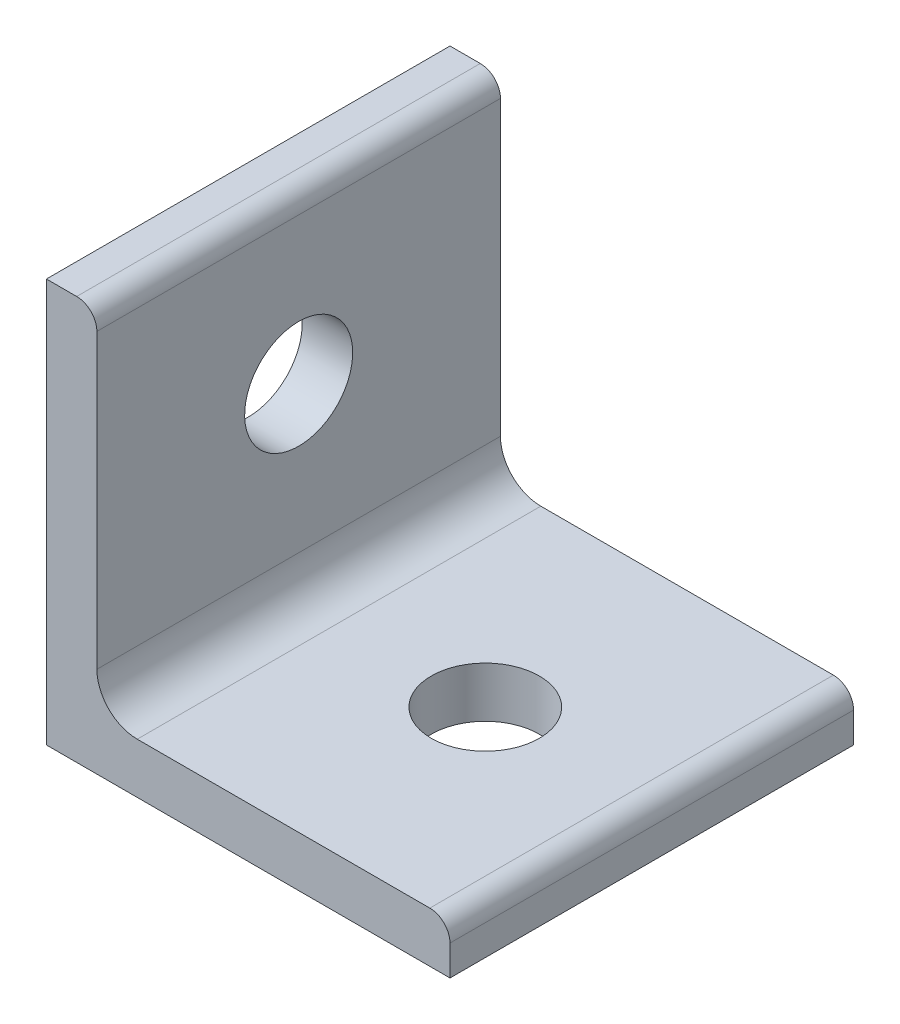
ISO-10303-21;
HEADER;
FILE_DESCRIPTION(('STEP AP214'),'2;1');
FILE_NAME('part.step','',(''),(''),'','','');
FILE_SCHEMA(('AUTOMOTIVE_DESIGN { 1 0 10303 214 1 1 1 1 }'));
ENDSEC;
DATA;
#1=APPLICATION_CONTEXT('core data for automotive mechanical design processes');
#2=APPLICATION_PROTOCOL_DEFINITION('international standard','automotive_design',2000,#1);
#3=PRODUCT_CONTEXT('',#1,'mechanical');
#4=PRODUCT('Part','Part','',(#3));
#5=PRODUCT_RELATED_PRODUCT_CATEGORY('part','',(#4));
#6=PRODUCT_DEFINITION_FORMATION('','',#4);
#7=PRODUCT_DEFINITION_CONTEXT('part definition',#1,'design');
#8=PRODUCT_DEFINITION('design','',#6,#7);
#9=PRODUCT_DEFINITION_SHAPE('','',#8);
#10=(LENGTH_UNIT() NAMED_UNIT(*) SI_UNIT(.MILLI.,.METRE.));
#11=(NAMED_UNIT(*) PLANE_ANGLE_UNIT() SI_UNIT($,.RADIAN.));
#12=(NAMED_UNIT(*) SI_UNIT($,.STERADIAN.) SOLID_ANGLE_UNIT());
#13=UNCERTAINTY_MEASURE_WITH_UNIT(LENGTH_MEASURE(1.E-05),#10,'distance_accuracy_value','');
#14=(GEOMETRIC_REPRESENTATION_CONTEXT(3) GLOBAL_UNCERTAINTY_ASSIGNED_CONTEXT((#13)) GLOBAL_UNIT_ASSIGNED_CONTEXT((#10,
#11,#12)) REPRESENTATION_CONTEXT('',''));
#15=CARTESIAN_POINT('',(0.,0.,0.));
#16=DIRECTION('',(0.,0.,1.));
#17=DIRECTION('',(1.,0.,0.));
#18=AXIS2_PLACEMENT_3D('',#15,#16,#17);
#19=CARTESIAN_POINT('',(12.7,0.,12.7));
#20=DIRECTION('',(0.,1.,0.));
#21=DIRECTION('',(-1.,0.,0.));
#22=AXIS2_PLACEMENT_3D('',#19,#20,#21);
#23=PLANE('',#22);
#24=CARTESIAN_POINT('',(7.46125,0.,6.35));
#25=DIRECTION('',(0.,1.,0.));
#26=DIRECTION('',(0.,0.,1.));
#27=AXIS2_PLACEMENT_3D('',#24,#25,#26);
#28=CIRCLE('',#27,1.7);
#29=CARTESIAN_POINT('',(7.46125,0.,8.05));
#30=VERTEX_POINT('',#29);
#31=EDGE_CURVE('E199',#30,#30,#28,.T.);
#32=ORIENTED_EDGE('',*,*,#31,.T.);
#33=EDGE_LOOP('',(#32));
#34=FACE_BOUND('',#33,.T.);
#35=DIRECTION('',(1.,0.,0.));
#36=VECTOR('',#35,1.);
#37=CARTESIAN_POINT('',(12.7,0.,0.));
#38=LINE('',#37,#36);
#39=CARTESIAN_POINT('',(0.,0.,0.));
#40=VERTEX_POINT('',#39);
#41=CARTESIAN_POINT('',(12.7,0.,0.));
#42=VERTEX_POINT('',#41);
#43=EDGE_CURVE('E127',#40,#42,#38,.T.);
#44=ORIENTED_EDGE('',*,*,#43,.T.);
#45=DIRECTION('',(0.,0.,-1.));
#46=VECTOR('',#45,1.);
#47=CARTESIAN_POINT('',(12.7,0.,12.7));
#48=LINE('',#47,#46);
#49=CARTESIAN_POINT('',(12.7,0.,12.7));
#50=VERTEX_POINT('',#49);
#51=EDGE_CURVE('E109',#50,#42,#48,.T.);
#52=ORIENTED_EDGE('',*,*,#51,.F.);
#53=DIRECTION('',(1.,0.,0.));
#54=VECTOR('',#53,1.);
#55=CARTESIAN_POINT('',(12.7,0.,12.7));
#56=LINE('',#55,#54);
#57=CARTESIAN_POINT('',(0.,0.,12.7));
#58=VERTEX_POINT('',#57);
#59=EDGE_CURVE('E115',#58,#50,#56,.T.);
#60=ORIENTED_EDGE('',*,*,#59,.F.);
#61=DIRECTION('',(0.,0.,-1.));
#62=VECTOR('',#61,1.);
#63=CARTESIAN_POINT('',(0.,0.,12.7));
#64=LINE('',#63,#62);
#65=EDGE_CURVE('E135',#58,#40,#64,.T.);
#66=ORIENTED_EDGE('',*,*,#65,.T.);
#67=EDGE_LOOP('',(#44,#52,#60,#66));
#68=FACE_BOUND('',#67,.T.);
#69=ADVANCED_FACE('F33',(#34,#68),#23,.F.);
#70=CARTESIAN_POINT('',(12.7,1.5875,12.7));
#71=DIRECTION('',(-1.,0.,0.));
#72=DIRECTION('',(0.,0.,1.));
#73=AXIS2_PLACEMENT_3D('',#70,#71,#72);
#74=PLANE('',#73);
#75=DIRECTION('',(0.,1.,0.));
#76=VECTOR('',#75,1.);
#77=CARTESIAN_POINT('',(12.7,1.5875,0.));
#78=LINE('',#77,#76);
#79=CARTESIAN_POINT('',(12.7,0.9525,0.));
#80=VERTEX_POINT('',#79);
#81=EDGE_CURVE('E182',#42,#80,#78,.T.);
#82=ORIENTED_EDGE('',*,*,#81,.T.);
#83=DIRECTION('',(0.,0.,-1.));
#84=VECTOR('',#83,1.);
#85=CARTESIAN_POINT('',(12.7,0.9525,12.7));
#86=LINE('',#85,#84);
#87=CARTESIAN_POINT('',(12.7,0.9525,12.7));
#88=VERTEX_POINT('',#87);
#89=EDGE_CURVE('E112',#80,#88,#86,.F.);
#90=ORIENTED_EDGE('',*,*,#89,.T.);
#91=DIRECTION('',(0.,1.,0.));
#92=VECTOR('',#91,1.);
#93=CARTESIAN_POINT('',(12.7,1.5875,12.7));
#94=LINE('',#93,#92);
#95=EDGE_CURVE('E104',#50,#88,#94,.T.);
#96=ORIENTED_EDGE('',*,*,#95,.F.);
#97=ORIENTED_EDGE('',*,*,#51,.T.);
#98=EDGE_LOOP('',(#82,#90,#96,#97));
#99=FACE_BOUND('',#98,.T.);
#100=ADVANCED_FACE('F107',(#99),#74,.F.);
#101=CARTESIAN_POINT('',(1.5875,1.5875,12.7));
#102=DIRECTION('',(0.,-1.,0.));
#103=DIRECTION('',(0.,0.,-1.));
#104=AXIS2_PLACEMENT_3D('',#101,#102,#103);
#105=PLANE('',#104);
#106=CARTESIAN_POINT('',(7.46125,1.5875,6.35));
#107=DIRECTION('',(0.,1.,0.));
#108=DIRECTION('',(0.,0.,1.));
#109=AXIS2_PLACEMENT_3D('',#106,#107,#108);
#110=CIRCLE('',#109,1.7);
#111=CARTESIAN_POINT('',(7.46125,1.5875,8.05));
#112=VERTEX_POINT('',#111);
#113=EDGE_CURVE('E202',#112,#112,#110,.T.);
#114=ORIENTED_EDGE('',*,*,#113,.F.);
#115=EDGE_LOOP('',(#114));
#116=FACE_BOUND('',#115,.T.);
#117=DIRECTION('',(-1.,0.,0.));
#118=VECTOR('',#117,1.);
#119=CARTESIAN_POINT('',(1.5875,1.5875,12.7));
#120=LINE('',#119,#118);
#121=CARTESIAN_POINT('',(12.065,1.5875,12.7));
#122=VERTEX_POINT('',#121);
#123=CARTESIAN_POINT('',(2.8575,1.5875,12.7));
#124=VERTEX_POINT('',#123);
#125=EDGE_CURVE('E114',#122,#124,#120,.T.);
#126=ORIENTED_EDGE('',*,*,#125,.F.);
#127=DIRECTION('',(0.,0.,-1.));
#128=VECTOR('',#127,1.);
#129=CARTESIAN_POINT('',(12.065,1.5875,12.7));
#130=LINE('',#129,#128);
#131=CARTESIAN_POINT('',(12.065,1.5875,0.));
#132=VERTEX_POINT('',#131);
#133=EDGE_CURVE('E146',#122,#132,#130,.T.);
#134=ORIENTED_EDGE('',*,*,#133,.T.);
#135=DIRECTION('',(-1.,0.,0.));
#136=VECTOR('',#135,1.);
#137=CARTESIAN_POINT('',(1.5875,1.5875,0.));
#138=LINE('',#137,#136);
#139=CARTESIAN_POINT('',(2.8575,1.5875,0.));
#140=VERTEX_POINT('',#139);
#141=EDGE_CURVE('E173',#132,#140,#138,.T.);
#142=ORIENTED_EDGE('',*,*,#141,.T.);
#143=DIRECTION('',(0.,0.,-1.));
#144=VECTOR('',#143,1.);
#145=CARTESIAN_POINT('',(2.8575,1.5875,12.7));
#146=LINE('',#145,#144);
#147=EDGE_CURVE('E132',#140,#124,#146,.F.);
#148=ORIENTED_EDGE('',*,*,#147,.T.);
#149=EDGE_LOOP('',(#126,#134,#142,#148));
#150=FACE_BOUND('',#149,.T.);
#151=ADVANCED_FACE('F186',(#116,#150),#105,.F.);
#152=CARTESIAN_POINT('',(1.5875,12.7,12.7));
#153=DIRECTION('',(-1.,0.,0.));
#154=DIRECTION('',(0.,-1.,0.));
#155=AXIS2_PLACEMENT_3D('',#152,#153,#154);
#156=PLANE('',#155);
#157=CARTESIAN_POINT('',(1.5875,7.46125,6.35));
#158=DIRECTION('',(1.,0.,0.));
#159=DIRECTION('',(0.,1.,0.));
#160=AXIS2_PLACEMENT_3D('',#157,#158,#159);
#161=CIRCLE('',#160,1.7);
#162=CARTESIAN_POINT('',(1.5875,9.16125,6.35));
#163=VERTEX_POINT('',#162);
#164=EDGE_CURVE('E196',#163,#163,#161,.T.);
#165=ORIENTED_EDGE('',*,*,#164,.F.);
#166=EDGE_LOOP('',(#165));
#167=FACE_BOUND('',#166,.T.);
#168=DIRECTION('',(0.,1.,0.));
#169=VECTOR('',#168,1.);
#170=CARTESIAN_POINT('',(1.5875,12.7,0.));
#171=LINE('',#170,#169);
#172=CARTESIAN_POINT('',(1.5875,2.8575,0.));
#173=VERTEX_POINT('',#172);
#174=CARTESIAN_POINT('',(1.5875,12.065,0.));
#175=VERTEX_POINT('',#174);
#176=EDGE_CURVE('E170',#173,#175,#171,.T.);
#177=ORIENTED_EDGE('',*,*,#176,.T.);
#178=DIRECTION('',(0.,0.,-1.));
#179=VECTOR('',#178,1.);
#180=CARTESIAN_POINT('',(1.5875,12.065,12.7));
#181=LINE('',#180,#179);
#182=CARTESIAN_POINT('',(1.5875,12.065,12.7));
#183=VERTEX_POINT('',#182);
#184=EDGE_CURVE('E11',#175,#183,#181,.F.);
#185=ORIENTED_EDGE('',*,*,#184,.T.);
#186=DIRECTION('',(0.,1.,0.));
#187=VECTOR('',#186,1.);
#188=CARTESIAN_POINT('',(1.5875,12.7,12.7));
#189=LINE('',#188,#187);
#190=CARTESIAN_POINT('',(1.5875,2.8575,12.7));
#191=VERTEX_POINT('',#190);
#192=EDGE_CURVE('E177',#191,#183,#189,.T.);
#193=ORIENTED_EDGE('',*,*,#192,.F.);
#194=DIRECTION('',(0.,0.,-1.));
#195=VECTOR('',#194,1.);
#196=CARTESIAN_POINT('',(1.5875,2.8575,0.));
#197=LINE('',#196,#195);
#198=EDGE_CURVE('E128',#191,#173,#197,.T.);
#199=ORIENTED_EDGE('',*,*,#198,.T.);
#200=EDGE_LOOP('',(#177,#185,#193,#199));
#201=FACE_BOUND('',#200,.T.);
#202=ADVANCED_FACE('F193',(#167,#201),#156,.F.);
#203=CARTESIAN_POINT('',(1.5875,12.7,12.7));
#204=DIRECTION('',(0.,-1.,0.));
#205=DIRECTION('',(0.,0.,-1.));
#206=AXIS2_PLACEMENT_3D('',#203,#204,#205);
#207=PLANE('',#206);
#208=DIRECTION('',(-1.,0.,0.));
#209=VECTOR('',#208,1.);
#210=CARTESIAN_POINT('',(1.5875,12.7,12.7));
#211=LINE('',#210,#209);
#212=CARTESIAN_POINT('',(0.9525,12.7,12.7));
#213=VERTEX_POINT('',#212);
#214=CARTESIAN_POINT('',(0.,12.7,12.7));
#215=VERTEX_POINT('',#214);
#216=EDGE_CURVE('E163',#213,#215,#211,.T.);
#217=ORIENTED_EDGE('',*,*,#216,.F.);
#218=DIRECTION('',(0.,0.,-1.));
#219=VECTOR('',#218,1.);
#220=CARTESIAN_POINT('',(0.9525,12.7,12.7));
#221=LINE('',#220,#219);
#222=CARTESIAN_POINT('',(0.9525,12.7,0.));
#223=VERTEX_POINT('',#222);
#224=EDGE_CURVE('E41',#213,#223,#221,.T.);
#225=ORIENTED_EDGE('',*,*,#224,.T.);
#226=DIRECTION('',(-1.,0.,0.));
#227=VECTOR('',#226,1.);
#228=CARTESIAN_POINT('',(1.5875,12.7,0.));
#229=LINE('',#228,#227);
#230=CARTESIAN_POINT('',(0.,12.7,0.));
#231=VERTEX_POINT('',#230);
#232=EDGE_CURVE('E162',#223,#231,#229,.T.);
#233=ORIENTED_EDGE('',*,*,#232,.T.);
#234=DIRECTION('',(0.,0.,-1.));
#235=VECTOR('',#234,1.);
#236=CARTESIAN_POINT('',(0.,12.7,12.7));
#237=LINE('',#236,#235);
#238=EDGE_CURVE('E129',#215,#231,#237,.T.);
#239=ORIENTED_EDGE('',*,*,#238,.F.);
#240=EDGE_LOOP('',(#217,#225,#233,#239));
#241=FACE_BOUND('',#240,.T.);
#242=ADVANCED_FACE('F160',(#241),#207,.F.);
#243=CARTESIAN_POINT('',(0.,0.,12.7));
#244=DIRECTION('',(1.,0.,0.));
#245=DIRECTION('',(0.,0.,-1.));
#246=AXIS2_PLACEMENT_3D('',#243,#244,#245);
#247=PLANE('',#246);
#248=CARTESIAN_POINT('',(0.,7.46125,6.35));
#249=DIRECTION('',(1.,0.,0.));
#250=DIRECTION('',(0.,1.,0.));
#251=AXIS2_PLACEMENT_3D('',#248,#249,#250);
#252=CIRCLE('',#251,1.7);
#253=CARTESIAN_POINT('',(0.,9.16125,6.35));
#254=VERTEX_POINT('',#253);
#255=EDGE_CURVE('E183',#254,#254,#252,.T.);
#256=ORIENTED_EDGE('',*,*,#255,.T.);
#257=EDGE_LOOP('',(#256));
#258=FACE_BOUND('',#257,.T.);
#259=DIRECTION('',(0.,-1.,0.));
#260=VECTOR('',#259,1.);
#261=CARTESIAN_POINT('',(0.,0.,0.));
#262=LINE('',#261,#260);
#263=EDGE_CURVE('E124',#231,#40,#262,.T.);
#264=ORIENTED_EDGE('',*,*,#263,.T.);
#265=ORIENTED_EDGE('',*,*,#65,.F.);
#266=DIRECTION('',(0.,-1.,0.));
#267=VECTOR('',#266,1.);
#268=CARTESIAN_POINT('',(0.,0.,12.7));
#269=LINE('',#268,#267);
#270=EDGE_CURVE('E120',#215,#58,#269,.T.);
#271=ORIENTED_EDGE('',*,*,#270,.F.);
#272=ORIENTED_EDGE('',*,*,#238,.T.);
#273=EDGE_LOOP('',(#264,#265,#271,#272));
#274=FACE_BOUND('',#273,.T.);
#275=ADVANCED_FACE('F249',(#258,#274),#247,.F.);
#276=CARTESIAN_POINT('',(0.,0.,12.7));
#277=DIRECTION('',(0.,0.,-1.));
#278=DIRECTION('',(-1.,0.,0.));
#279=AXIS2_PLACEMENT_3D('',#276,#277,#278);
#280=PLANE('',#279);
#281=ORIENTED_EDGE('',*,*,#95,.T.);
#282=CARTESIAN_POINT('',(12.065,0.9525,12.7));
#283=DIRECTION('',(0.,0.,-1.));
#284=DIRECTION('',(-1.,0.,0.));
#285=AXIS2_PLACEMENT_3D('',#282,#283,#284);
#286=CIRCLE('',#285,0.635);
#287=EDGE_CURVE('E155',#88,#122,#286,.F.);
#288=ORIENTED_EDGE('',*,*,#287,.T.);
#289=ORIENTED_EDGE('',*,*,#125,.T.);
#290=CARTESIAN_POINT('',(2.8575,2.8575,12.7));
#291=DIRECTION('',(0.,0.,-1.));
#292=DIRECTION('',(-1.,0.,0.));
#293=AXIS2_PLACEMENT_3D('',#290,#291,#292);
#294=CIRCLE('',#293,1.27);
#295=EDGE_CURVE('E144',#124,#191,#294,.T.);
#296=ORIENTED_EDGE('',*,*,#295,.T.);
#297=ORIENTED_EDGE('',*,*,#192,.T.);
#298=CARTESIAN_POINT('',(0.9525,12.065,12.7));
#299=DIRECTION('',(0.,0.,-1.));
#300=DIRECTION('',(-1.,0.,0.));
#301=AXIS2_PLACEMENT_3D('',#298,#299,#300);
#302=CIRCLE('',#301,0.635);
#303=EDGE_CURVE('E48',#183,#213,#302,.F.);
#304=ORIENTED_EDGE('',*,*,#303,.T.);
#305=ORIENTED_EDGE('',*,*,#216,.T.);
#306=ORIENTED_EDGE('',*,*,#270,.T.);
#307=ORIENTED_EDGE('',*,*,#59,.T.);
#308=EDGE_LOOP('',(#281,#288,#289,#296,#297,#304,#305,#306,#307));
#309=FACE_BOUND('',#308,.T.);
#310=ADVANCED_FACE('F118',(#309),#280,.F.);
#311=CARTESIAN_POINT('',(0.,0.,0.));
#312=DIRECTION('',(0.,0.,-1.));
#313=DIRECTION('',(-1.,0.,0.));
#314=AXIS2_PLACEMENT_3D('',#311,#312,#313);
#315=PLANE('',#314);
#316=ORIENTED_EDGE('',*,*,#141,.F.);
#317=CARTESIAN_POINT('',(12.065,0.9525,0.));
#318=DIRECTION('',(0.,0.,-1.));
#319=DIRECTION('',(-1.,0.,0.));
#320=AXIS2_PLACEMENT_3D('',#317,#318,#319);
#321=CIRCLE('',#320,0.635);
#322=EDGE_CURVE('E151',#132,#80,#321,.T.);
#323=ORIENTED_EDGE('',*,*,#322,.T.);
#324=ORIENTED_EDGE('',*,*,#81,.F.);
#325=ORIENTED_EDGE('',*,*,#43,.F.);
#326=ORIENTED_EDGE('',*,*,#263,.F.);
#327=ORIENTED_EDGE('',*,*,#232,.F.);
#328=CARTESIAN_POINT('',(0.9525,12.065,0.));
#329=DIRECTION('',(0.,0.,-1.));
#330=DIRECTION('',(-1.,0.,0.));
#331=AXIS2_PLACEMENT_3D('',#328,#329,#330);
#332=CIRCLE('',#331,0.635);
#333=EDGE_CURVE('E149',#223,#175,#332,.T.);
#334=ORIENTED_EDGE('',*,*,#333,.T.);
#335=ORIENTED_EDGE('',*,*,#176,.F.);
#336=CARTESIAN_POINT('',(2.8575,2.8575,0.));
#337=DIRECTION('',(0.,0.,-1.));
#338=DIRECTION('',(-1.,0.,0.));
#339=AXIS2_PLACEMENT_3D('',#336,#337,#338);
#340=CIRCLE('',#339,1.27);
#341=EDGE_CURVE('E141',#173,#140,#340,.F.);
#342=ORIENTED_EDGE('',*,*,#341,.T.);
#343=EDGE_LOOP('',(#316,#323,#324,#325,#326,#327,#334,#335,#342));
#344=FACE_BOUND('',#343,.T.);
#345=ADVANCED_FACE('F168',(#344),#315,.T.);
#346=CARTESIAN_POINT('',(2.8575,2.8575,12.7));
#347=DIRECTION('',(0.,0.,1.));
#348=DIRECTION('',(1.,0.,0.));
#349=AXIS2_PLACEMENT_3D('',#346,#347,#348);
#350=CYLINDRICAL_SURFACE('',#349,1.27);
#351=ORIENTED_EDGE('',*,*,#295,.F.);
#352=ORIENTED_EDGE('',*,*,#147,.F.);
#353=ORIENTED_EDGE('',*,*,#341,.F.);
#354=ORIENTED_EDGE('',*,*,#198,.F.);
#355=EDGE_LOOP('',(#351,#352,#353,#354));
#356=FACE_BOUND('',#355,.T.);
#357=ADVANCED_FACE('F192',(#356),#350,.F.);
#358=CARTESIAN_POINT('',(12.065,0.9525,12.7));
#359=DIRECTION('',(0.,0.,-1.));
#360=DIRECTION('',(-1.,0.,0.));
#361=AXIS2_PLACEMENT_3D('',#358,#359,#360);
#362=CYLINDRICAL_SURFACE('',#361,0.635);
#363=ORIENTED_EDGE('',*,*,#287,.F.);
#364=ORIENTED_EDGE('',*,*,#89,.F.);
#365=ORIENTED_EDGE('',*,*,#322,.F.);
#366=ORIENTED_EDGE('',*,*,#133,.F.);
#367=EDGE_LOOP('',(#363,#364,#365,#366));
#368=FACE_BOUND('',#367,.T.);
#369=ADVANCED_FACE('F231',(#368),#362,.T.);
#370=CARTESIAN_POINT('',(0.9525,12.065,12.7));
#371=DIRECTION('',(0.,0.,-1.));
#372=DIRECTION('',(-1.,0.,0.));
#373=AXIS2_PLACEMENT_3D('',#370,#371,#372);
#374=CYLINDRICAL_SURFACE('',#373,0.635);
#375=ORIENTED_EDGE('',*,*,#303,.F.);
#376=ORIENTED_EDGE('',*,*,#184,.F.);
#377=ORIENTED_EDGE('',*,*,#333,.F.);
#378=ORIENTED_EDGE('',*,*,#224,.F.);
#379=EDGE_LOOP('',(#375,#376,#377,#378));
#380=FACE_BOUND('',#379,.T.);
#381=ADVANCED_FACE('F35',(#380),#374,.T.);
#382=CARTESIAN_POINT('',(0.,7.46125,6.35));
#383=DIRECTION('',(1.,0.,0.));
#384=DIRECTION('',(0.,1.,0.));
#385=AXIS2_PLACEMENT_3D('',#382,#383,#384);
#386=CYLINDRICAL_SURFACE('',#385,1.7);
#387=ORIENTED_EDGE('',*,*,#255,.F.);
#388=EDGE_LOOP('',(#387));
#389=FACE_BOUND('',#388,.T.);
#390=ORIENTED_EDGE('',*,*,#164,.T.);
#391=EDGE_LOOP('',(#390));
#392=FACE_BOUND('',#391,.T.);
#393=ADVANCED_FACE('F212',(#389,#392),#386,.F.);
#394=CARTESIAN_POINT('',(7.46125,0.,6.35));
#395=DIRECTION('',(0.,1.,0.));
#396=DIRECTION('',(0.,0.,1.));
#397=AXIS2_PLACEMENT_3D('',#394,#395,#396);
#398=CYLINDRICAL_SURFACE('',#397,1.7);
#399=CARTESIAN_POINT('',(7.46125,0.,8.05));
#400=CARTESIAN_POINT('',(7.46125,0.0165364583333331,8.05));
#401=CARTESIAN_POINT('',(7.46125,0.0330729166666665,8.05));
#402=CARTESIAN_POINT('',(7.46125,0.0661458333333331,8.05));
#403=CARTESIAN_POINT('',(7.46125,0.0826822916666665,8.05));
#404=CARTESIAN_POINT('',(7.46125,0.115755208333333,8.05));
#405=CARTESIAN_POINT('',(7.46125,0.132291666666666,8.05));
#406=CARTESIAN_POINT('',(7.46125,0.165364583333333,8.05));
#407=CARTESIAN_POINT('',(7.46125,0.181901041666666,8.05));
#408=CARTESIAN_POINT('',(7.46125,0.214973958333333,8.05));
#409=CARTESIAN_POINT('',(7.46125,0.231510416666666,8.05));
#410=CARTESIAN_POINT('',(7.46125,0.264583333333333,8.05));
#411=CARTESIAN_POINT('',(7.46125,0.281119791666666,8.05));
#412=CARTESIAN_POINT('',(7.46125,0.314192708333333,8.05));
#413=CARTESIAN_POINT('',(7.46125,0.330729166666666,8.05));
#414=CARTESIAN_POINT('',(7.46125,0.363802083333333,8.05));
#415=CARTESIAN_POINT('',(7.46125,0.380338541666666,8.05));
#416=CARTESIAN_POINT('',(7.46125,0.413411458333333,8.05));
#417=CARTESIAN_POINT('',(7.46125,0.429947916666666,8.05));
#418=CARTESIAN_POINT('',(7.46125,0.463020833333333,8.05));
#419=CARTESIAN_POINT('',(7.46125,0.479557291666666,8.05));
#420=CARTESIAN_POINT('',(7.46125,0.512630208333333,8.05));
#421=CARTESIAN_POINT('',(7.46125,0.529166666666666,8.05));
#422=CARTESIAN_POINT('',(7.46125,0.562239583333333,8.05));
#423=CARTESIAN_POINT('',(7.46125,0.578776041666666,8.05));
#424=CARTESIAN_POINT('',(7.46125,0.611848958333333,8.05));
#425=CARTESIAN_POINT('',(7.46125,0.628385416666666,8.05));
#426=CARTESIAN_POINT('',(7.46125,0.661458333333333,8.05));
#427=CARTESIAN_POINT('',(7.46125,0.677994791666666,8.05));
#428=CARTESIAN_POINT('',(7.46125,0.711067708333333,8.05));
#429=CARTESIAN_POINT('',(7.46125,0.727604166666666,8.05));
#430=CARTESIAN_POINT('',(7.46125,0.760677083333333,8.05));
#431=CARTESIAN_POINT('',(7.46125,0.777213541666666,8.05));
#432=CARTESIAN_POINT('',(7.46125,0.810286458333333,8.05));
#433=CARTESIAN_POINT('',(7.46125,0.826822916666666,8.05));
#434=CARTESIAN_POINT('',(7.46125,0.859895833333333,8.05));
#435=CARTESIAN_POINT('',(7.46125,0.876432291666666,8.05));
#436=CARTESIAN_POINT('',(7.46125,0.909505208333333,8.05));
#437=CARTESIAN_POINT('',(7.46125,0.926041666666667,8.05));
#438=CARTESIAN_POINT('',(7.46125,0.959114583333333,8.05));
#439=CARTESIAN_POINT('',(7.46125,0.975651041666666,8.05));
#440=CARTESIAN_POINT('',(7.46125,1.00872395833333,8.05));
#441=CARTESIAN_POINT('',(7.46125,1.02526041666667,8.05));
#442=CARTESIAN_POINT('',(7.46125,1.05833333333333,8.05));
#443=CARTESIAN_POINT('',(7.46125,1.07486979166667,8.05));
#444=CARTESIAN_POINT('',(7.46125,1.10794270833333,8.05));
#445=CARTESIAN_POINT('',(7.46125,1.12447916666667,8.05));
#446=CARTESIAN_POINT('',(7.46125,1.15755208333333,8.05));
#447=CARTESIAN_POINT('',(7.46125,1.17408854166667,8.05));
#448=CARTESIAN_POINT('',(7.46125,1.20716145833333,8.05));
#449=CARTESIAN_POINT('',(7.46125,1.22369791666667,8.05));
#450=CARTESIAN_POINT('',(7.46125,1.25677083333333,8.05));
#451=CARTESIAN_POINT('',(7.46125,1.27330729166667,8.05));
#452=CARTESIAN_POINT('',(7.46125,1.30638020833333,8.05));
#453=CARTESIAN_POINT('',(7.46125,1.32291666666667,8.05));
#454=CARTESIAN_POINT('',(7.46125,1.35598958333333,8.05));
#455=CARTESIAN_POINT('',(7.46125,1.37252604166667,8.05));
#456=CARTESIAN_POINT('',(7.46125,1.40559895833333,8.05));
#457=CARTESIAN_POINT('',(7.46125,1.42213541666667,8.05));
#458=CARTESIAN_POINT('',(7.46125,1.45520833333333,8.05));
#459=CARTESIAN_POINT('',(7.46125,1.47174479166667,8.05));
#460=CARTESIAN_POINT('',(7.46125,1.50481770833333,8.05));
#461=CARTESIAN_POINT('',(7.46125,1.52135416666667,8.05));
#462=CARTESIAN_POINT('',(7.46125,1.55442708333333,8.05));
#463=CARTESIAN_POINT('',(7.46125,1.57096354166667,8.05));
#464=CARTESIAN_POINT('',(7.46125,1.5875,8.05));
#465=B_SPLINE_CURVE_WITH_KNOTS('',3,(#399,#400,#401,#402,#403,#404,#405,#406,#407,#408,#409,
#410,#411,#412,#413,#414,#415,#416,#417,#418,#419,#420,#421,#422,#423,#424,#425,#426,#427,#428,
#429,#430,#431,#432,#433,#434,#435,#436,#437,#438,#439,#440,#441,#442,#443,#444,#445,#446,#447,
#448,#449,#450,#451,#452,#453,#454,#455,#456,#457,#458,#459,#460,#461,#462,#463,#464),
.UNSPECIFIED.,.F.,.F.,(4,2,2,2,2,2,2,2,2,2,2,2,2,2,2,2,2,2,2,2,2,2,2,2,2,2,2,2,2,2,2,2,4),(0.,
0.049609375,0.09921875,0.148828125,0.1984375,0.248046875,0.29765625,0.347265625,0.396875,
0.446484375,0.49609375,0.545703125,0.5953125,0.644921875,0.69453125,0.744140625,0.79375,
0.843359375,0.89296875,0.942578125,0.9921875,1.041796875,1.09140625,1.141015625,1.190625,
1.240234375,1.28984375,1.339453125,1.3890625,1.438671875,1.48828125,1.537890625,1.5875),.UNSPECIFIED.);
#466=EDGE_CURVE('BSEAM209',#30,#112,#465,.T.);
#467=ORIENTED_EDGE('',*,*,#31,.F.);
#468=ORIENTED_EDGE('',*,*,#113,.T.);
#469=ORIENTED_EDGE('',*,*,#466,.T.);
#470=ORIENTED_EDGE('',*,*,#466,.F.);
#471=EDGE_LOOP('',(#467,#469,#468,#470));
#472=FACE_BOUND('',#471,.T.);
#473=ADVANCED_FACE('F209',(#472),#398,.F.);
#474=CLOSED_SHELL('',(#69,#100,#151,#202,#242,#275,#310,#345,#357,#369,#381,#393,#473));
#475=MANIFOLD_SOLID_BREP('B2',#474);
#476=ADVANCED_BREP_SHAPE_REPRESENTATION('',(#18,#475),#14);
#477=SHAPE_DEFINITION_REPRESENTATION(#9,#476);
ENDSEC;
END-ISO-10303-21;
